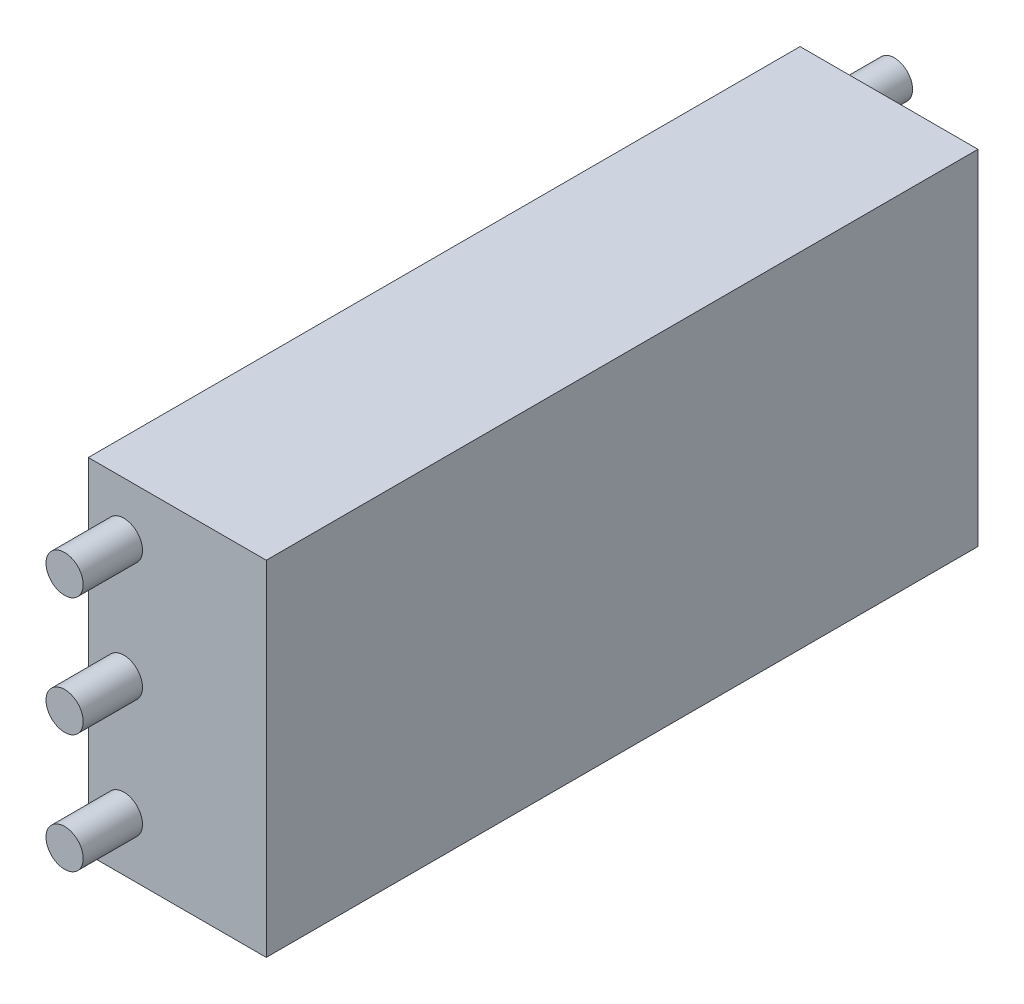
ISO-10303-21;
HEADER;
FILE_DESCRIPTION(('STEP AP214'),'2;1');
FILE_NAME('part.step','',(''),(''),'','','');
FILE_SCHEMA(('AUTOMOTIVE_DESIGN { 1 0 10303 214 1 1 1 1 }'));
ENDSEC;
DATA;
#1=APPLICATION_CONTEXT('core data for automotive mechanical design processes');
#2=APPLICATION_PROTOCOL_DEFINITION('international standard','automotive_design',2000,#1);
#3=PRODUCT_CONTEXT('',#1,'mechanical');
#4=PRODUCT('Part','Part','',(#3));
#5=PRODUCT_RELATED_PRODUCT_CATEGORY('part','',(#4));
#6=PRODUCT_DEFINITION_FORMATION('','',#4);
#7=PRODUCT_DEFINITION_CONTEXT('part definition',#1,'design');
#8=PRODUCT_DEFINITION('design','',#6,#7);
#9=PRODUCT_DEFINITION_SHAPE('','',#8);
#10=(LENGTH_UNIT() NAMED_UNIT(*) SI_UNIT(.MILLI.,.METRE.));
#11=(NAMED_UNIT(*) PLANE_ANGLE_UNIT() SI_UNIT($,.RADIAN.));
#12=(NAMED_UNIT(*) SI_UNIT($,.STERADIAN.) SOLID_ANGLE_UNIT());
#13=UNCERTAINTY_MEASURE_WITH_UNIT(LENGTH_MEASURE(1.E-05),#10,'distance_accuracy_value','');
#14=(GEOMETRIC_REPRESENTATION_CONTEXT(3) GLOBAL_UNCERTAINTY_ASSIGNED_CONTEXT((#13)) GLOBAL_UNIT_ASSIGNED_CONTEXT((#10,
#11,#12)) REPRESENTATION_CONTEXT('',''));
#15=CARTESIAN_POINT('',(0.,0.,0.));
#16=DIRECTION('',(0.,0.,1.));
#17=DIRECTION('',(1.,0.,0.));
#18=AXIS2_PLACEMENT_3D('',#15,#16,#17);
#19=CARTESIAN_POINT('',(15.,0.,0.));
#20=DIRECTION('',(0.,0.,-1.));
#21=DIRECTION('',(-1.,0.,0.));
#22=AXIS2_PLACEMENT_3D('',#19,#20,#21);
#23=PLANE('',#22);
#24=CARTESIAN_POINT('',(3.,4.5,0.));
#25=DIRECTION('',(0.,0.,-1.));
#26=DIRECTION('',(-1.,0.,0.));
#27=AXIS2_PLACEMENT_3D('',#24,#25,#26);
#28=CIRCLE('',#27,1.5673941723039);
#29=CARTESIAN_POINT('',(1.4326058276961,4.5,0.));
#30=VERTEX_POINT('',#29);
#31=EDGE_CURVE('E126',#30,#30,#28,.F.);
#32=ORIENTED_EDGE('',*,*,#31,.F.);
#33=EDGE_LOOP('',(#32));
#34=FACE_BOUND('',#33,.T.);
#35=CARTESIAN_POINT('',(3.,14.5,0.));
#36=DIRECTION('',(0.,0.,-1.));
#37=DIRECTION('',(-1.,0.,0.));
#38=AXIS2_PLACEMENT_3D('',#35,#36,#37);
#39=CIRCLE('',#38,1.5673941723039);
#40=CARTESIAN_POINT('',(1.4326058276961,14.5,0.));
#41=VERTEX_POINT('',#40);
#42=EDGE_CURVE('E123',#41,#41,#39,.F.);
#43=ORIENTED_EDGE('',*,*,#42,.F.);
#44=EDGE_LOOP('',(#43));
#45=FACE_BOUND('',#44,.T.);
#46=CARTESIAN_POINT('',(3.,24.5,0.));
#47=DIRECTION('',(0.,0.,-1.));
#48=DIRECTION('',(-1.,0.,0.));
#49=AXIS2_PLACEMENT_3D('',#46,#47,#48);
#50=CIRCLE('',#49,1.5673941723039);
#51=CARTESIAN_POINT('',(1.4326058276961,24.5,0.));
#52=VERTEX_POINT('',#51);
#53=EDGE_CURVE('E120',#52,#52,#50,.F.);
#54=ORIENTED_EDGE('',*,*,#53,.F.);
#55=EDGE_LOOP('',(#54));
#56=FACE_BOUND('',#55,.T.);
#57=DIRECTION('',(0.,-1.,0.));
#58=VECTOR('',#57,1.);
#59=CARTESIAN_POINT('',(0.,0.,0.));
#60=LINE('',#59,#58);
#61=CARTESIAN_POINT('',(0.,29.,0.));
#62=VERTEX_POINT('',#61);
#63=CARTESIAN_POINT('',(0.,0.,0.));
#64=VERTEX_POINT('',#63);
#65=EDGE_CURVE('E110',#62,#64,#60,.T.);
#66=ORIENTED_EDGE('',*,*,#65,.T.);
#67=DIRECTION('',(-1.,0.,0.));
#68=VECTOR('',#67,1.);
#69=CARTESIAN_POINT('',(15.,0.,0.));
#70=LINE('',#69,#68);
#71=CARTESIAN_POINT('',(15.,0.,0.));
#72=VERTEX_POINT('',#71);
#73=EDGE_CURVE('E101',#72,#64,#70,.T.);
#74=ORIENTED_EDGE('',*,*,#73,.F.);
#75=DIRECTION('',(0.,-1.,0.));
#76=VECTOR('',#75,1.);
#77=CARTESIAN_POINT('',(15.,0.,0.));
#78=LINE('',#77,#76);
#79=CARTESIAN_POINT('',(15.,29.,0.));
#80=VERTEX_POINT('',#79);
#81=EDGE_CURVE('E95',#80,#72,#78,.T.);
#82=ORIENTED_EDGE('',*,*,#81,.F.);
#83=DIRECTION('',(-1.,0.,0.));
#84=VECTOR('',#83,1.);
#85=CARTESIAN_POINT('',(15.,29.,0.));
#86=LINE('',#85,#84);
#87=EDGE_CURVE('E106',#80,#62,#86,.T.);
#88=ORIENTED_EDGE('',*,*,#87,.T.);
#89=EDGE_LOOP('',(#66,#74,#82,#88));
#90=FACE_BOUND('',#89,.T.);
#91=ADVANCED_FACE('F43',(#34,#45,#56,#90),#23,.F.);
#92=CARTESIAN_POINT('',(15.,0.,0.));
#93=DIRECTION('',(0.,1.,0.));
#94=DIRECTION('',(0.,0.,1.));
#95=AXIS2_PLACEMENT_3D('',#92,#93,#94);
#96=PLANE('',#95);
#97=DIRECTION('',(0.,0.,-1.));
#98=VECTOR('',#97,1.);
#99=CARTESIAN_POINT('',(0.,0.,0.));
#100=LINE('',#99,#98);
#101=CARTESIAN_POINT('',(0.,0.,-60.));
#102=VERTEX_POINT('',#101);
#103=EDGE_CURVE('E100',#64,#102,#100,.T.);
#104=ORIENTED_EDGE('',*,*,#103,.T.);
#105=DIRECTION('',(-1.,0.,0.));
#106=VECTOR('',#105,1.);
#107=CARTESIAN_POINT('',(15.,0.,-60.));
#108=LINE('',#107,#106);
#109=CARTESIAN_POINT('',(15.,0.,-60.));
#110=VERTEX_POINT('',#109);
#111=EDGE_CURVE('E98',#110,#102,#108,.T.);
#112=ORIENTED_EDGE('',*,*,#111,.F.);
#113=DIRECTION('',(0.,0.,-1.));
#114=VECTOR('',#113,1.);
#115=CARTESIAN_POINT('',(15.,0.,0.));
#116=LINE('',#115,#114);
#117=EDGE_CURVE('E90',#72,#110,#116,.T.);
#118=ORIENTED_EDGE('',*,*,#117,.F.);
#119=ORIENTED_EDGE('',*,*,#73,.T.);
#120=EDGE_LOOP('',(#104,#112,#118,#119));
#121=FACE_BOUND('',#120,.T.);
#122=ADVANCED_FACE('F99',(#121),#96,.F.);
#123=CARTESIAN_POINT('',(15.,0.,-60.));
#124=DIRECTION('',(0.,0.,1.));
#125=DIRECTION('',(1.,0.,0.));
#126=AXIS2_PLACEMENT_3D('',#123,#124,#125);
#127=PLANE('',#126);
#128=CARTESIAN_POINT('',(2.94741497137187,3.41917983597971,-60.));
#129=DIRECTION('',(0.,0.,1.));
#130=DIRECTION('',(1.,0.,0.));
#131=AXIS2_PLACEMENT_3D('',#128,#129,#130);
#132=CIRCLE('',#131,1.53936100048213);
#133=CARTESIAN_POINT('',(4.486775971854,3.41917983597971,-60.));
#134=VERTEX_POINT('',#133);
#135=EDGE_CURVE('E11',#134,#134,#132,.F.);
#136=ORIENTED_EDGE('',*,*,#135,.F.);
#137=EDGE_LOOP('',(#136));
#138=FACE_BOUND('',#137,.T.);
#139=CARTESIAN_POINT('',(2.94741497137187,25.6151792963117,-60.));
#140=DIRECTION('',(0.,0.,1.));
#141=DIRECTION('',(1.,0.,0.));
#142=AXIS2_PLACEMENT_3D('',#139,#140,#141);
#143=CIRCLE('',#142,1.53936100048213);
#144=CARTESIAN_POINT('',(4.486775971854,25.6151792963117,-60.));
#145=VERTEX_POINT('',#144);
#146=EDGE_CURVE('E51',#145,#145,#143,.F.);
#147=ORIENTED_EDGE('',*,*,#146,.F.);
#148=EDGE_LOOP('',(#147));
#149=FACE_BOUND('',#148,.T.);
#150=DIRECTION('',(0.,1.,0.));
#151=VECTOR('',#150,1.);
#152=CARTESIAN_POINT('',(0.,0.,-60.));
#153=LINE('',#152,#151);
#154=CARTESIAN_POINT('',(0.,29.,-60.));
#155=VERTEX_POINT('',#154);
#156=EDGE_CURVE('E76',#102,#155,#153,.T.);
#157=ORIENTED_EDGE('',*,*,#156,.T.);
#158=DIRECTION('',(-1.,0.,0.));
#159=VECTOR('',#158,1.);
#160=CARTESIAN_POINT('',(15.,29.,-60.));
#161=LINE('',#160,#159);
#162=CARTESIAN_POINT('',(15.,29.,-60.));
#163=VERTEX_POINT('',#162);
#164=EDGE_CURVE('E102',#163,#155,#161,.T.);
#165=ORIENTED_EDGE('',*,*,#164,.F.);
#166=DIRECTION('',(0.,1.,0.));
#167=VECTOR('',#166,1.);
#168=CARTESIAN_POINT('',(15.,0.,-60.));
#169=LINE('',#168,#167);
#170=EDGE_CURVE('E93',#110,#163,#169,.T.);
#171=ORIENTED_EDGE('',*,*,#170,.F.);
#172=ORIENTED_EDGE('',*,*,#111,.T.);
#173=EDGE_LOOP('',(#157,#165,#171,#172));
#174=FACE_BOUND('',#173,.T.);
#175=ADVANCED_FACE('F104',(#138,#149,#174),#127,.F.);
#176=CARTESIAN_POINT('',(15.,29.,0.));
#177=DIRECTION('',(0.,-1.,0.));
#178=DIRECTION('',(0.,0.,-1.));
#179=AXIS2_PLACEMENT_3D('',#176,#177,#178);
#180=PLANE('',#179);
#181=DIRECTION('',(0.,0.,1.));
#182=VECTOR('',#181,1.);
#183=CARTESIAN_POINT('',(0.,29.,0.));
#184=LINE('',#183,#182);
#185=EDGE_CURVE('E82',#155,#62,#184,.T.);
#186=ORIENTED_EDGE('',*,*,#185,.T.);
#187=ORIENTED_EDGE('',*,*,#87,.F.);
#188=DIRECTION('',(0.,0.,1.));
#189=VECTOR('',#188,1.);
#190=CARTESIAN_POINT('',(15.,29.,0.));
#191=LINE('',#190,#189);
#192=EDGE_CURVE('E59',#163,#80,#191,.T.);
#193=ORIENTED_EDGE('',*,*,#192,.F.);
#194=ORIENTED_EDGE('',*,*,#164,.T.);
#195=EDGE_LOOP('',(#186,#187,#193,#194));
#196=FACE_BOUND('',#195,.T.);
#197=ADVANCED_FACE('F134',(#196),#180,.F.);
#198=CARTESIAN_POINT('',(15.,0.,0.));
#199=DIRECTION('',(-1.,0.,0.));
#200=DIRECTION('',(0.,0.,1.));
#201=AXIS2_PLACEMENT_3D('',#198,#199,#200);
#202=PLANE('',#201);
#203=ORIENTED_EDGE('',*,*,#81,.T.);
#204=ORIENTED_EDGE('',*,*,#117,.T.);
#205=ORIENTED_EDGE('',*,*,#170,.T.);
#206=ORIENTED_EDGE('',*,*,#192,.T.);
#207=EDGE_LOOP('',(#203,#204,#205,#206));
#208=FACE_BOUND('',#207,.T.);
#209=ADVANCED_FACE('F91',(#208),#202,.F.);
#210=CARTESIAN_POINT('',(0.,0.,0.));
#211=DIRECTION('',(-1.,0.,0.));
#212=DIRECTION('',(0.,0.,1.));
#213=AXIS2_PLACEMENT_3D('',#210,#211,#212);
#214=PLANE('',#213);
#215=ORIENTED_EDGE('',*,*,#65,.F.);
#216=ORIENTED_EDGE('',*,*,#185,.F.);
#217=ORIENTED_EDGE('',*,*,#156,.F.);
#218=ORIENTED_EDGE('',*,*,#103,.F.);
#219=EDGE_LOOP('',(#215,#216,#217,#218));
#220=FACE_BOUND('',#219,.T.);
#221=ADVANCED_FACE('F159',(#220),#214,.T.);
#222=CARTESIAN_POINT('',(3.,24.5,5.));
#223=DIRECTION('',(0.,0.,-1.));
#224=DIRECTION('',(-1.,0.,0.));
#225=AXIS2_PLACEMENT_3D('',#222,#223,#224);
#226=CYLINDRICAL_SURFACE('',#225,1.5673941723039);
#227=CARTESIAN_POINT('',(3.,24.5,5.));
#228=DIRECTION('',(0.,0.,1.));
#229=DIRECTION('',(1.,0.,0.));
#230=AXIS2_PLACEMENT_3D('',#227,#228,#229);
#231=CIRCLE('',#230,1.5673941723039);
#232=CARTESIAN_POINT('',(4.5673941723039,24.5,5.));
#233=VERTEX_POINT('',#232);
#234=EDGE_CURVE('E113',#233,#233,#231,.T.);
#235=ORIENTED_EDGE('',*,*,#234,.F.);
#236=EDGE_LOOP('',(#235));
#237=FACE_BOUND('',#236,.T.);
#238=ORIENTED_EDGE('',*,*,#53,.T.);
#239=EDGE_LOOP('',(#238));
#240=FACE_BOUND('',#239,.T.);
#241=ADVANCED_FACE('F160',(#237,#240),#226,.T.);
#242=CARTESIAN_POINT('',(3.,24.5,5.));
#243=DIRECTION('',(0.,0.,1.));
#244=DIRECTION('',(1.,0.,0.));
#245=AXIS2_PLACEMENT_3D('',#242,#243,#244);
#246=PLANE('',#245);
#247=ORIENTED_EDGE('',*,*,#234,.T.);
#248=EDGE_LOOP('',(#247));
#249=FACE_BOUND('',#248,.T.);
#250=ADVANCED_FACE('F166',(#249),#246,.T.);
#251=CARTESIAN_POINT('',(3.,14.5,5.));
#252=DIRECTION('',(0.,0.,-1.));
#253=DIRECTION('',(-1.,0.,0.));
#254=AXIS2_PLACEMENT_3D('',#251,#252,#253);
#255=CYLINDRICAL_SURFACE('',#254,1.5673941723039);
#256=CARTESIAN_POINT('',(3.,14.5,5.));
#257=DIRECTION('',(0.,0.,1.));
#258=DIRECTION('',(1.,0.,0.));
#259=AXIS2_PLACEMENT_3D('',#256,#257,#258);
#260=CIRCLE('',#259,1.5673941723039);
#261=CARTESIAN_POINT('',(4.56739417230391,14.5,5.));
#262=VERTEX_POINT('',#261);
#263=EDGE_CURVE('E218',#262,#262,#260,.T.);
#264=ORIENTED_EDGE('',*,*,#263,.F.);
#265=EDGE_LOOP('',(#264));
#266=FACE_BOUND('',#265,.T.);
#267=ORIENTED_EDGE('',*,*,#42,.T.);
#268=EDGE_LOOP('',(#267));
#269=FACE_BOUND('',#268,.T.);
#270=ADVANCED_FACE('F173',(#266,#269),#255,.T.);
#271=CARTESIAN_POINT('',(3.,14.5,5.));
#272=DIRECTION('',(0.,0.,1.));
#273=DIRECTION('',(1.,0.,0.));
#274=AXIS2_PLACEMENT_3D('',#271,#272,#273);
#275=PLANE('',#274);
#276=ORIENTED_EDGE('',*,*,#263,.T.);
#277=EDGE_LOOP('',(#276));
#278=FACE_BOUND('',#277,.T.);
#279=ADVANCED_FACE('F177',(#278),#275,.T.);
#280=CARTESIAN_POINT('',(3.,4.5,5.));
#281=DIRECTION('',(0.,0.,-1.));
#282=DIRECTION('',(-1.,0.,0.));
#283=AXIS2_PLACEMENT_3D('',#280,#281,#282);
#284=CYLINDRICAL_SURFACE('',#283,1.5673941723039);
#285=CARTESIAN_POINT('',(3.,4.5,5.));
#286=DIRECTION('',(0.,0.,1.));
#287=DIRECTION('',(1.,0.,0.));
#288=AXIS2_PLACEMENT_3D('',#285,#286,#287);
#289=CIRCLE('',#288,1.5673941723039);
#290=CARTESIAN_POINT('',(4.56739417230391,4.5,5.));
#291=VERTEX_POINT('',#290);
#292=EDGE_CURVE('E213',#291,#291,#289,.T.);
#293=ORIENTED_EDGE('',*,*,#292,.F.);
#294=EDGE_LOOP('',(#293));
#295=FACE_BOUND('',#294,.T.);
#296=ORIENTED_EDGE('',*,*,#31,.T.);
#297=EDGE_LOOP('',(#296));
#298=FACE_BOUND('',#297,.T.);
#299=ADVANCED_FACE('F181',(#295,#298),#284,.T.);
#300=CARTESIAN_POINT('',(3.,4.5,5.));
#301=DIRECTION('',(0.,0.,1.));
#302=DIRECTION('',(1.,0.,0.));
#303=AXIS2_PLACEMENT_3D('',#300,#301,#302);
#304=PLANE('',#303);
#305=ORIENTED_EDGE('',*,*,#292,.T.);
#306=EDGE_LOOP('',(#305));
#307=FACE_BOUND('',#306,.T.);
#308=ADVANCED_FACE('F185',(#307),#304,.T.);
#309=CARTESIAN_POINT('',(2.94741497137187,25.6151792963117,-65.));
#310=DIRECTION('',(0.,0.,1.));
#311=DIRECTION('',(1.,0.,0.));
#312=AXIS2_PLACEMENT_3D('',#309,#310,#311);
#313=CYLINDRICAL_SURFACE('',#312,1.53936100048213);
#314=CARTESIAN_POINT('',(2.94741497137187,25.6151792963117,-65.));
#315=DIRECTION('',(0.,0.,-1.));
#316=DIRECTION('',(-1.,0.,0.));
#317=AXIS2_PLACEMENT_3D('',#314,#315,#316);
#318=CIRCLE('',#317,1.53936100048213);
#319=CARTESIAN_POINT('',(1.40805397088974,25.6151792963117,-65.));
#320=VERTEX_POINT('',#319);
#321=EDGE_CURVE('E210',#320,#320,#318,.T.);
#322=ORIENTED_EDGE('',*,*,#321,.F.);
#323=EDGE_LOOP('',(#322));
#324=FACE_BOUND('',#323,.T.);
#325=ORIENTED_EDGE('',*,*,#146,.T.);
#326=EDGE_LOOP('',(#325));
#327=FACE_BOUND('',#326,.T.);
#328=ADVANCED_FACE('F131',(#324,#327),#313,.T.);
#329=CARTESIAN_POINT('',(2.94741497137187,25.6151792963117,-65.));
#330=DIRECTION('',(0.,0.,-1.));
#331=DIRECTION('',(-1.,0.,0.));
#332=AXIS2_PLACEMENT_3D('',#329,#330,#331);
#333=PLANE('',#332);
#334=ORIENTED_EDGE('',*,*,#321,.T.);
#335=EDGE_LOOP('',(#334));
#336=FACE_BOUND('',#335,.T.);
#337=ADVANCED_FACE('F192',(#336),#333,.T.);
#338=CARTESIAN_POINT('',(2.94741497137187,3.41917983597971,-65.));
#339=DIRECTION('',(0.,0.,1.));
#340=DIRECTION('',(1.,0.,0.));
#341=AXIS2_PLACEMENT_3D('',#338,#339,#340);
#342=CYLINDRICAL_SURFACE('',#341,1.53936100048213);
#343=CARTESIAN_POINT('',(2.94741497137187,3.41917983597971,-65.));
#344=DIRECTION('',(0.,0.,-1.));
#345=DIRECTION('',(-1.,0.,0.));
#346=AXIS2_PLACEMENT_3D('',#343,#344,#345);
#347=CIRCLE('',#346,1.53936100048213);
#348=CARTESIAN_POINT('',(1.40805397088974,3.41917983597971,-65.));
#349=VERTEX_POINT('',#348);
#350=EDGE_CURVE('E209',#349,#349,#347,.T.);
#351=ORIENTED_EDGE('',*,*,#350,.F.);
#352=EDGE_LOOP('',(#351));
#353=FACE_BOUND('',#352,.T.);
#354=ORIENTED_EDGE('',*,*,#135,.T.);
#355=EDGE_LOOP('',(#354));
#356=FACE_BOUND('',#355,.T.);
#357=ADVANCED_FACE('F196',(#353,#356),#342,.T.);
#358=CARTESIAN_POINT('',(2.94741497137187,3.41917983597971,-65.));
#359=DIRECTION('',(0.,0.,-1.));
#360=DIRECTION('',(-1.,0.,0.));
#361=AXIS2_PLACEMENT_3D('',#358,#359,#360);
#362=PLANE('',#361);
#363=ORIENTED_EDGE('',*,*,#350,.T.);
#364=EDGE_LOOP('',(#363));
#365=FACE_BOUND('',#364,.T.);
#366=ADVANCED_FACE('F200',(#365),#362,.T.);
#367=CLOSED_SHELL('',(#91,#122,#175,#197,#209,#221,#241,#250,#270,#279,#299,#308,#328,#337,#357,#366));
#368=MANIFOLD_SOLID_BREP('B2',#367);
#369=ADVANCED_BREP_SHAPE_REPRESENTATION('',(#18,#368),#14);
#370=SHAPE_DEFINITION_REPRESENTATION(#9,#369);
ENDSEC;
END-ISO-10303-21;
